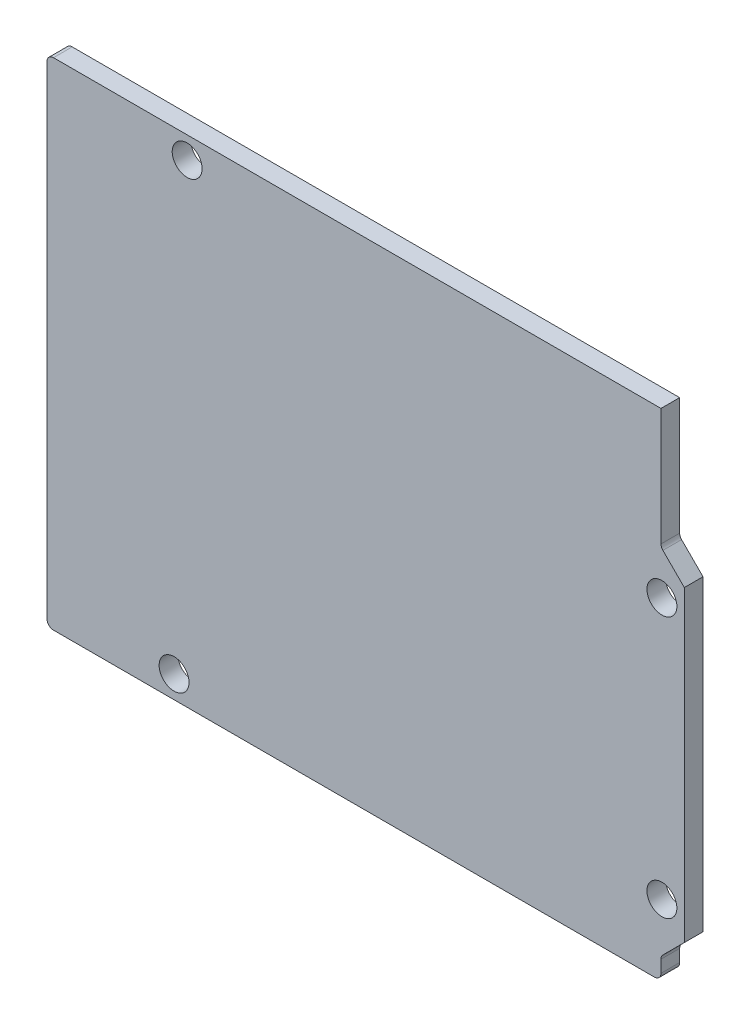
ISO-10303-21;
HEADER;
FILE_DESCRIPTION(('STEP AP214'),'2;1');
FILE_NAME('part.step','',(''),(''),'','','');
FILE_SCHEMA(('AUTOMOTIVE_DESIGN { 1 0 10303 214 1 1 1 1 }'));
ENDSEC;
DATA;
#1=APPLICATION_CONTEXT('core data for automotive mechanical design processes');
#2=APPLICATION_PROTOCOL_DEFINITION('international standard','automotive_design',2000,#1);
#3=PRODUCT_CONTEXT('',#1,'mechanical');
#4=PRODUCT('Part','Part','',(#3));
#5=PRODUCT_RELATED_PRODUCT_CATEGORY('part','',(#4));
#6=PRODUCT_DEFINITION_FORMATION('','',#4);
#7=PRODUCT_DEFINITION_CONTEXT('part definition',#1,'design');
#8=PRODUCT_DEFINITION('design','',#6,#7);
#9=PRODUCT_DEFINITION_SHAPE('','',#8);
#10=(LENGTH_UNIT() NAMED_UNIT(*) SI_UNIT(.MILLI.,.METRE.));
#11=(NAMED_UNIT(*) PLANE_ANGLE_UNIT() SI_UNIT($,.RADIAN.));
#12=(NAMED_UNIT(*) SI_UNIT($,.STERADIAN.) SOLID_ANGLE_UNIT());
#13=UNCERTAINTY_MEASURE_WITH_UNIT(LENGTH_MEASURE(1.E-05),#10,'distance_accuracy_value','');
#14=(GEOMETRIC_REPRESENTATION_CONTEXT(3) GLOBAL_UNCERTAINTY_ASSIGNED_CONTEXT((#13)) GLOBAL_UNIT_ASSIGNED_CONTEXT((#10,
#11,#12)) REPRESENTATION_CONTEXT('',''));
#15=CARTESIAN_POINT('',(0.,0.,0.));
#16=DIRECTION('',(0.,0.,1.));
#17=DIRECTION('',(1.,0.,0.));
#18=AXIS2_PLACEMENT_3D('',#15,#16,#17);
#19=CARTESIAN_POINT('',(-36.5080291852134,0.,4.5));
#20=DIRECTION('',(1.,0.,0.));
#21=DIRECTION('',(0.,0.,-1.));
#22=AXIS2_PLACEMENT_3D('',#19,#20,#21);
#23=PLANE('',#22);
#24=DIRECTION('',(0.,-1.,0.));
#25=VECTOR('',#24,1.);
#26=CARTESIAN_POINT('',(-36.5080291852134,0.,2.5));
#27=LINE('',#26,#25);
#28=CARTESIAN_POINT('',(-36.5080291852134,-42.375,2.5));
#29=VERTEX_POINT('',#28);
#30=CARTESIAN_POINT('',(-36.5080291852134,-94.025,2.5));
#31=VERTEX_POINT('',#30);
#32=EDGE_CURVE('E175',#29,#31,#27,.T.);
#33=ORIENTED_EDGE('',*,*,#32,.T.);
#34=DIRECTION('',(0.,0.,-1.));
#35=VECTOR('',#34,1.);
#36=CARTESIAN_POINT('',(-36.5080291852134,-94.025,4.5));
#37=LINE('',#36,#35);
#38=CARTESIAN_POINT('',(-36.5080291852134,-94.025,4.5));
#39=VERTEX_POINT('',#38);
#40=EDGE_CURVE('E11',#39,#31,#37,.T.);
#41=ORIENTED_EDGE('',*,*,#40,.F.);
#42=DIRECTION('',(0.,-1.,0.));
#43=VECTOR('',#42,1.);
#44=CARTESIAN_POINT('',(-36.5080291852134,0.,4.5));
#45=LINE('',#44,#43);
#46=CARTESIAN_POINT('',(-36.5080291852134,-42.375,4.5));
#47=VERTEX_POINT('',#46);
#48=EDGE_CURVE('E267',#47,#39,#45,.T.);
#49=ORIENTED_EDGE('',*,*,#48,.F.);
#50=DIRECTION('',(0.,0.,-1.));
#51=VECTOR('',#50,1.);
#52=CARTESIAN_POINT('',(-36.5080291852134,-42.375,4.5));
#53=LINE('',#52,#51);
#54=EDGE_CURVE('E159',#47,#29,#53,.T.);
#55=ORIENTED_EDGE('',*,*,#54,.T.);
#56=EDGE_LOOP('',(#33,#41,#49,#55));
#57=FACE_BOUND('',#56,.T.);
#58=ADVANCED_FACE('F37',(#57),#23,.F.);
#59=CARTESIAN_POINT('',(-35.8080291852134,-94.025,4.5));
#60=DIRECTION('',(0.,0.,-1.));
#61=DIRECTION('',(-1.,0.,0.));
#62=AXIS2_PLACEMENT_3D('',#59,#60,#61);
#63=CYLINDRICAL_SURFACE('',#62,0.700000000000003);
#64=CARTESIAN_POINT('',(-35.8080291852134,-94.025,2.5));
#65=DIRECTION('',(0.,0.,1.));
#66=DIRECTION('',(1.,0.,0.));
#67=AXIS2_PLACEMENT_3D('',#64,#65,#66);
#68=CIRCLE('',#67,0.700000000000003);
#69=CARTESIAN_POINT('',(-35.8080291852134,-94.725,2.5));
#70=VERTEX_POINT('',#69);
#71=EDGE_CURVE('E178',#31,#70,#68,.T.);
#72=ORIENTED_EDGE('',*,*,#71,.T.);
#73=DIRECTION('',(0.,0.,-1.));
#74=VECTOR('',#73,1.);
#75=CARTESIAN_POINT('',(-35.8080291852134,-94.725,4.5));
#76=LINE('',#75,#74);
#77=CARTESIAN_POINT('',(-35.8080291852134,-94.725,4.5));
#78=VERTEX_POINT('',#77);
#79=EDGE_CURVE('E46',#78,#70,#76,.T.);
#80=ORIENTED_EDGE('',*,*,#79,.F.);
#81=CARTESIAN_POINT('',(-35.8080291852134,-94.025,4.5));
#82=DIRECTION('',(0.,0.,1.));
#83=DIRECTION('',(1.,0.,0.));
#84=AXIS2_PLACEMENT_3D('',#81,#82,#83);
#85=CIRCLE('',#84,0.700000000000003);
#86=EDGE_CURVE('E112',#39,#78,#85,.T.);
#87=ORIENTED_EDGE('',*,*,#86,.F.);
#88=ORIENTED_EDGE('',*,*,#40,.T.);
#89=EDGE_LOOP('',(#72,#80,#87,#88));
#90=FACE_BOUND('',#89,.T.);
#91=ADVANCED_FACE('F282',(#90),#63,.T.);
#92=CARTESIAN_POINT('',(0.,-94.725,4.5));
#93=DIRECTION('',(0.,1.,0.));
#94=DIRECTION('',(0.,0.,1.));
#95=AXIS2_PLACEMENT_3D('',#92,#93,#94);
#96=PLANE('',#95);
#97=DIRECTION('',(1.,0.,0.));
#98=VECTOR('',#97,1.);
#99=CARTESIAN_POINT('',(0.,-94.725,2.5));
#100=LINE('',#99,#98);
#101=CARTESIAN_POINT('',(28.4919708147866,-94.725,2.5));
#102=VERTEX_POINT('',#101);
#103=EDGE_CURVE('E180',#70,#102,#100,.T.);
#104=ORIENTED_EDGE('',*,*,#103,.T.);
#105=DIRECTION('',(0.,0.,-1.));
#106=VECTOR('',#105,1.);
#107=CARTESIAN_POINT('',(28.4919708147866,-94.725,4.5));
#108=LINE('',#107,#106);
#109=CARTESIAN_POINT('',(28.4919708147866,-94.725,4.5));
#110=VERTEX_POINT('',#109);
#111=EDGE_CURVE('E222',#110,#102,#108,.T.);
#112=ORIENTED_EDGE('',*,*,#111,.F.);
#113=DIRECTION('',(1.,0.,0.));
#114=VECTOR('',#113,1.);
#115=CARTESIAN_POINT('',(0.,-94.725,4.5));
#116=LINE('',#115,#114);
#117=EDGE_CURVE('E230',#78,#110,#116,.T.);
#118=ORIENTED_EDGE('',*,*,#117,.F.);
#119=ORIENTED_EDGE('',*,*,#79,.T.);
#120=EDGE_LOOP('',(#104,#112,#118,#119));
#121=FACE_BOUND('',#120,.T.);
#122=ADVANCED_FACE('F228',(#121),#96,.F.);
#123=CARTESIAN_POINT('',(28.4919708147866,-94.025,4.5));
#124=DIRECTION('',(0.,0.,-1.));
#125=DIRECTION('',(-1.,0.,0.));
#126=AXIS2_PLACEMENT_3D('',#123,#124,#125);
#127=CYLINDRICAL_SURFACE('',#126,0.700000000000006);
#128=CARTESIAN_POINT('',(28.4919708147866,-94.025,2.5));
#129=DIRECTION('',(0.,0.,1.));
#130=DIRECTION('',(1.,0.,0.));
#131=AXIS2_PLACEMENT_3D('',#128,#129,#130);
#132=CIRCLE('',#131,0.700000000000006);
#133=CARTESIAN_POINT('',(29.1919708147866,-94.025,2.5));
#134=VERTEX_POINT('',#133);
#135=EDGE_CURVE('E182',#102,#134,#132,.T.);
#136=ORIENTED_EDGE('',*,*,#135,.T.);
#137=DIRECTION('',(0.,0.,-1.));
#138=VECTOR('',#137,1.);
#139=CARTESIAN_POINT('',(29.1919708147866,-94.025,4.5));
#140=LINE('',#139,#138);
#141=CARTESIAN_POINT('',(29.1919708147866,-94.025,4.5));
#142=VERTEX_POINT('',#141);
#143=EDGE_CURVE('E219',#142,#134,#140,.T.);
#144=ORIENTED_EDGE('',*,*,#143,.F.);
#145=CARTESIAN_POINT('',(28.4919708147866,-94.025,4.5));
#146=DIRECTION('',(0.,0.,1.));
#147=DIRECTION('',(1.,0.,0.));
#148=AXIS2_PLACEMENT_3D('',#145,#146,#147);
#149=CIRCLE('',#148,0.700000000000006);
#150=EDGE_CURVE('E248',#110,#142,#149,.T.);
#151=ORIENTED_EDGE('',*,*,#150,.F.);
#152=ORIENTED_EDGE('',*,*,#111,.T.);
#153=EDGE_LOOP('',(#136,#144,#151,#152));
#154=FACE_BOUND('',#153,.T.);
#155=ADVANCED_FACE('F238',(#154),#127,.T.);
#156=CARTESIAN_POINT('',(29.1919708147866,0.,4.5));
#157=DIRECTION('',(-1.,0.,0.));
#158=DIRECTION('',(0.,0.,1.));
#159=AXIS2_PLACEMENT_3D('',#156,#157,#158);
#160=PLANE('',#159);
#161=DIRECTION('',(0.,1.,0.));
#162=VECTOR('',#161,1.);
#163=CARTESIAN_POINT('',(29.1919708147866,0.,2.5));
#164=LINE('',#163,#162);
#165=CARTESIAN_POINT('',(29.1919708147866,-92.7149494936612,2.5));
#166=VERTEX_POINT('',#165);
#167=EDGE_CURVE('E184',#134,#166,#164,.T.);
#168=ORIENTED_EDGE('',*,*,#167,.T.);
#169=DIRECTION('',(0.,0.,-1.));
#170=VECTOR('',#169,1.);
#171=CARTESIAN_POINT('',(29.1919708147866,-92.7149494936612,4.5));
#172=LINE('',#171,#170);
#173=CARTESIAN_POINT('',(29.1919708147866,-92.7149494936612,4.5));
#174=VERTEX_POINT('',#173);
#175=EDGE_CURVE('E217',#174,#166,#172,.T.);
#176=ORIENTED_EDGE('',*,*,#175,.F.);
#177=DIRECTION('',(0.,1.,0.));
#178=VECTOR('',#177,1.);
#179=CARTESIAN_POINT('',(29.1919708147866,0.,4.5));
#180=LINE('',#179,#178);
#181=EDGE_CURVE('E244',#142,#174,#180,.T.);
#182=ORIENTED_EDGE('',*,*,#181,.F.);
#183=ORIENTED_EDGE('',*,*,#143,.T.);
#184=EDGE_LOOP('',(#168,#176,#182,#183));
#185=FACE_BOUND('',#184,.T.);
#186=ADVANCED_FACE('F242',(#185),#160,.F.);
#187=CARTESIAN_POINT('',(29.8919708147866,-92.7149494936612,4.5));
#188=DIRECTION('',(0.,0.,-1.));
#189=DIRECTION('',(-1.,0.,0.));
#190=AXIS2_PLACEMENT_3D('',#187,#188,#189);
#191=CYLINDRICAL_SURFACE('',#190,0.700000000000002);
#192=CARTESIAN_POINT('',(29.8919708147866,-92.7149494936612,2.5));
#193=DIRECTION('',(0.,0.,1.));
#194=DIRECTION('',(1.,0.,0.));
#195=AXIS2_PLACEMENT_3D('',#192,#193,#194);
#196=CIRCLE('',#195,0.700000000000002);
#197=CARTESIAN_POINT('',(29.396996067956,-92.2199747468306,2.5));
#198=VERTEX_POINT('',#197);
#199=EDGE_CURVE('E187',#198,#166,#196,.T.);
#200=ORIENTED_EDGE('',*,*,#199,.F.);
#201=DIRECTION('',(0.,0.,-1.));
#202=VECTOR('',#201,1.);
#203=CARTESIAN_POINT('',(29.396996067956,-92.2199747468306,4.5));
#204=LINE('',#203,#202);
#205=CARTESIAN_POINT('',(29.396996067956,-92.2199747468306,4.5));
#206=VERTEX_POINT('',#205);
#207=EDGE_CURVE('E215',#206,#198,#204,.T.);
#208=ORIENTED_EDGE('',*,*,#207,.F.);
#209=CARTESIAN_POINT('',(29.8919708147866,-92.7149494936612,4.5));
#210=DIRECTION('',(0.,0.,1.));
#211=DIRECTION('',(1.,0.,0.));
#212=AXIS2_PLACEMENT_3D('',#209,#210,#211);
#213=CIRCLE('',#212,0.700000000000002);
#214=EDGE_CURVE('E247',#206,#174,#213,.T.);
#215=ORIENTED_EDGE('',*,*,#214,.T.);
#216=ORIENTED_EDGE('',*,*,#175,.T.);
#217=EDGE_LOOP('',(#200,#208,#215,#216));
#218=FACE_BOUND('',#217,.T.);
#219=ADVANCED_FACE('F403',(#218),#191,.F.);
#220=CARTESIAN_POINT('',(60.8084854073933,-60.8084854073932,4.5));
#221=DIRECTION('',(-0.707106781186549,0.707106781186546,0.));
#222=DIRECTION('',(-0.707106781186546,-0.707106781186549,0.));
#223=AXIS2_PLACEMENT_3D('',#220,#221,#222);
#224=PLANE('',#223);
#225=DIRECTION('',(0.707106781186546,0.707106781186549,0.));
#226=VECTOR('',#225,1.);
#227=CARTESIAN_POINT('',(60.8084854073933,-60.8084854073932,2.5));
#228=LINE('',#227,#226);
#229=CARTESIAN_POINT('',(31.6919708147866,-89.925,2.5));
#230=VERTEX_POINT('',#229);
#231=EDGE_CURVE('E190',#198,#230,#228,.T.);
#232=ORIENTED_EDGE('',*,*,#231,.T.);
#233=DIRECTION('',(0.,0.,-1.));
#234=VECTOR('',#233,1.);
#235=CARTESIAN_POINT('',(31.6919708147866,-89.925,4.5));
#236=LINE('',#235,#234);
#237=CARTESIAN_POINT('',(31.6919708147866,-89.925,4.5));
#238=VERTEX_POINT('',#237);
#239=EDGE_CURVE('E212',#238,#230,#236,.T.);
#240=ORIENTED_EDGE('',*,*,#239,.F.);
#241=DIRECTION('',(0.707106781186546,0.707106781186549,0.));
#242=VECTOR('',#241,1.);
#243=CARTESIAN_POINT('',(60.8084854073933,-60.8084854073932,4.5));
#244=LINE('',#243,#242);
#245=EDGE_CURVE('E250',#206,#238,#244,.T.);
#246=ORIENTED_EDGE('',*,*,#245,.F.);
#247=ORIENTED_EDGE('',*,*,#207,.T.);
#248=EDGE_LOOP('',(#232,#240,#246,#247));
#249=FACE_BOUND('',#248,.T.);
#250=ADVANCED_FACE('F393',(#249),#224,.F.);
#251=CARTESIAN_POINT('',(31.6919708147866,0.,4.5));
#252=DIRECTION('',(-1.,0.,0.));
#253=DIRECTION('',(0.,-1.,0.));
#254=AXIS2_PLACEMENT_3D('',#251,#252,#253);
#255=PLANE('',#254);
#256=DIRECTION('',(0.,1.,0.));
#257=VECTOR('',#256,1.);
#258=CARTESIAN_POINT('',(31.6919708147866,0.,2.5));
#259=LINE('',#258,#257);
#260=CARTESIAN_POINT('',(31.6919708147866,-57.025,2.5));
#261=VERTEX_POINT('',#260);
#262=EDGE_CURVE('E192',#230,#261,#259,.T.);
#263=ORIENTED_EDGE('',*,*,#262,.T.);
#264=DIRECTION('',(0.,0.,-1.));
#265=VECTOR('',#264,1.);
#266=CARTESIAN_POINT('',(31.6919708147866,-57.025,4.5));
#267=LINE('',#266,#265);
#268=CARTESIAN_POINT('',(31.6919708147866,-57.025,4.5));
#269=VERTEX_POINT('',#268);
#270=EDGE_CURVE('E209',#269,#261,#267,.T.);
#271=ORIENTED_EDGE('',*,*,#270,.F.);
#272=DIRECTION('',(0.,1.,0.));
#273=VECTOR('',#272,1.);
#274=CARTESIAN_POINT('',(31.6919708147866,0.,4.5));
#275=LINE('',#274,#273);
#276=EDGE_CURVE('E256',#238,#269,#275,.T.);
#277=ORIENTED_EDGE('',*,*,#276,.F.);
#278=ORIENTED_EDGE('',*,*,#239,.T.);
#279=EDGE_LOOP('',(#263,#271,#277,#278));
#280=FACE_BOUND('',#279,.T.);
#281=ADVANCED_FACE('F383',(#280),#255,.F.);
#282=CARTESIAN_POINT('',(-12.6665145926068,-12.6665145926068,4.5));
#283=DIRECTION('',(-0.707106781186546,-0.707106781186549,0.));
#284=DIRECTION('',(0.707106781186549,-0.707106781186546,0.));
#285=AXIS2_PLACEMENT_3D('',#282,#283,#284);
#286=PLANE('',#285);
#287=DIRECTION('',(-0.707106781186549,0.707106781186546,0.));
#288=VECTOR('',#287,1.);
#289=CARTESIAN_POINT('',(-12.6665145926068,-12.6665145926068,2.5));
#290=LINE('',#289,#288);
#291=CARTESIAN_POINT('',(29.396996067956,-54.7300252531695,2.5));
#292=VERTEX_POINT('',#291);
#293=EDGE_CURVE('E194',#261,#292,#290,.T.);
#294=ORIENTED_EDGE('',*,*,#293,.T.);
#295=DIRECTION('',(0.,0.,-1.));
#296=VECTOR('',#295,1.);
#297=CARTESIAN_POINT('',(29.396996067956,-54.7300252531695,4.5));
#298=LINE('',#297,#296);
#299=CARTESIAN_POINT('',(29.396996067956,-54.7300252531695,4.5));
#300=VERTEX_POINT('',#299);
#301=EDGE_CURVE('E207',#300,#292,#298,.T.);
#302=ORIENTED_EDGE('',*,*,#301,.F.);
#303=DIRECTION('',(-0.707106781186549,0.707106781186546,0.));
#304=VECTOR('',#303,1.);
#305=CARTESIAN_POINT('',(-12.6665145926068,-12.6665145926068,4.5));
#306=LINE('',#305,#304);
#307=EDGE_CURVE('E258',#269,#300,#306,.T.);
#308=ORIENTED_EDGE('',*,*,#307,.F.);
#309=ORIENTED_EDGE('',*,*,#270,.T.);
#310=EDGE_LOOP('',(#294,#302,#308,#309));
#311=FACE_BOUND('',#310,.T.);
#312=ADVANCED_FACE('F374',(#311),#286,.F.);
#313=CARTESIAN_POINT('',(29.8919708147866,-54.2350505063389,4.5));
#314=DIRECTION('',(0.,0.,-1.));
#315=DIRECTION('',(-1.,0.,0.));
#316=AXIS2_PLACEMENT_3D('',#313,#314,#315);
#317=CYLINDRICAL_SURFACE('',#316,0.700000000000001);
#318=CARTESIAN_POINT('',(29.8919708147866,-54.2350505063389,2.5));
#319=DIRECTION('',(0.,0.,1.));
#320=DIRECTION('',(1.,0.,0.));
#321=AXIS2_PLACEMENT_3D('',#318,#319,#320);
#322=CIRCLE('',#321,0.700000000000001);
#323=CARTESIAN_POINT('',(29.1919708147866,-54.2350505063389,2.5));
#324=VERTEX_POINT('',#323);
#325=EDGE_CURVE('E197',#324,#292,#322,.T.);
#326=ORIENTED_EDGE('',*,*,#325,.F.);
#327=DIRECTION('',(0.,0.,-1.));
#328=VECTOR('',#327,1.);
#329=CARTESIAN_POINT('',(29.1919708147866,-54.2350505063389,4.5));
#330=LINE('',#329,#328);
#331=CARTESIAN_POINT('',(29.1919708147866,-54.2350505063389,4.5));
#332=VERTEX_POINT('',#331);
#333=EDGE_CURVE('E154',#332,#324,#330,.T.);
#334=ORIENTED_EDGE('',*,*,#333,.F.);
#335=CARTESIAN_POINT('',(29.8919708147866,-54.2350505063389,4.5));
#336=DIRECTION('',(0.,0.,1.));
#337=DIRECTION('',(1.,0.,0.));
#338=AXIS2_PLACEMENT_3D('',#335,#336,#337);
#339=CIRCLE('',#338,0.700000000000001);
#340=EDGE_CURVE('E147',#332,#300,#339,.T.);
#341=ORIENTED_EDGE('',*,*,#340,.T.);
#342=ORIENTED_EDGE('',*,*,#301,.T.);
#343=EDGE_LOOP('',(#326,#334,#341,#342));
#344=FACE_BOUND('',#343,.T.);
#345=ADVANCED_FACE('F261',(#344),#317,.F.);
#346=CARTESIAN_POINT('',(29.1919708147866,0.,4.5));
#347=DIRECTION('',(-1.,0.,0.));
#348=DIRECTION('',(0.,-1.,0.));
#349=AXIS2_PLACEMENT_3D('',#346,#347,#348);
#350=PLANE('',#349);
#351=DIRECTION('',(0.,1.,0.));
#352=VECTOR('',#351,1.);
#353=CARTESIAN_POINT('',(29.1919708147866,0.,2.5));
#354=LINE('',#353,#352);
#355=CARTESIAN_POINT('',(29.1919708147866,-41.675,2.5));
#356=VERTEX_POINT('',#355);
#357=EDGE_CURVE('E153',#324,#356,#354,.T.);
#358=ORIENTED_EDGE('',*,*,#357,.T.);
#359=DIRECTION('',(0.,0.,-1.));
#360=VECTOR('',#359,1.);
#361=CARTESIAN_POINT('',(29.1919708147866,-41.675,4.5));
#362=LINE('',#361,#360);
#363=CARTESIAN_POINT('',(29.1919708147866,-41.675,4.5));
#364=VERTEX_POINT('',#363);
#365=EDGE_CURVE('E150',#364,#356,#362,.T.);
#366=ORIENTED_EDGE('',*,*,#365,.F.);
#367=DIRECTION('',(0.,1.,0.));
#368=VECTOR('',#367,1.);
#369=CARTESIAN_POINT('',(29.1919708147866,0.,4.5));
#370=LINE('',#369,#368);
#371=EDGE_CURVE('E141',#332,#364,#370,.T.);
#372=ORIENTED_EDGE('',*,*,#371,.F.);
#373=ORIENTED_EDGE('',*,*,#333,.T.);
#374=EDGE_LOOP('',(#358,#366,#372,#373));
#375=FACE_BOUND('',#374,.T.);
#376=ADVANCED_FACE('F151',(#375),#350,.F.);
#377=CARTESIAN_POINT('',(0.,-41.675,4.5));
#378=DIRECTION('',(0.,-1.,0.));
#379=DIRECTION('',(0.,0.,-1.));
#380=AXIS2_PLACEMENT_3D('',#377,#378,#379);
#381=PLANE('',#380);
#382=DIRECTION('',(-1.,0.,0.));
#383=VECTOR('',#382,1.);
#384=CARTESIAN_POINT('',(0.,-41.675,2.5));
#385=LINE('',#384,#383);
#386=CARTESIAN_POINT('',(-35.8080291852134,-41.675,2.5));
#387=VERTEX_POINT('',#386);
#388=EDGE_CURVE('E98',#356,#387,#385,.T.);
#389=ORIENTED_EDGE('',*,*,#388,.T.);
#390=DIRECTION('',(0.,0.,-1.));
#391=VECTOR('',#390,1.);
#392=CARTESIAN_POINT('',(-35.8080291852134,-41.675,4.5));
#393=LINE('',#392,#391);
#394=CARTESIAN_POINT('',(-35.8080291852134,-41.675,4.5));
#395=VERTEX_POINT('',#394);
#396=EDGE_CURVE('E155',#395,#387,#393,.T.);
#397=ORIENTED_EDGE('',*,*,#396,.F.);
#398=DIRECTION('',(-1.,0.,0.));
#399=VECTOR('',#398,1.);
#400=CARTESIAN_POINT('',(0.,-41.675,4.5));
#401=LINE('',#400,#399);
#402=EDGE_CURVE('E145',#364,#395,#401,.T.);
#403=ORIENTED_EDGE('',*,*,#402,.F.);
#404=ORIENTED_EDGE('',*,*,#365,.T.);
#405=EDGE_LOOP('',(#389,#397,#403,#404));
#406=FACE_BOUND('',#405,.T.);
#407=ADVANCED_FACE('F157',(#406),#381,.F.);
#408=CARTESIAN_POINT('',(29.2919708147866,-87.125,4.5));
#409=DIRECTION('',(0.,0.,-1.));
#410=DIRECTION('',(-1.,0.,0.));
#411=AXIS2_PLACEMENT_3D('',#408,#409,#410);
#412=CYLINDRICAL_SURFACE('',#411,1.60000000000001);
#413=CARTESIAN_POINT('',(29.2919708147866,-87.125,4.5));
#414=DIRECTION('',(0.,0.,1.));
#415=DIRECTION('',(1.,0.,0.));
#416=AXIS2_PLACEMENT_3D('',#413,#414,#415);
#417=CIRCLE('',#416,1.60000000000001);
#418=CARTESIAN_POINT('',(30.8919708147866,-87.125,4.5));
#419=VERTEX_POINT('',#418);
#420=EDGE_CURVE('E466',#419,#419,#417,.T.);
#421=ORIENTED_EDGE('',*,*,#420,.T.);
#422=EDGE_LOOP('',(#421));
#423=FACE_BOUND('',#422,.T.);
#424=CARTESIAN_POINT('',(29.2919708147866,-87.125,2.5));
#425=DIRECTION('',(0.,0.,1.));
#426=DIRECTION('',(1.,0.,0.));
#427=AXIS2_PLACEMENT_3D('',#424,#425,#426);
#428=CIRCLE('',#427,1.60000000000001);
#429=CARTESIAN_POINT('',(30.8919708147866,-87.125,2.5));
#430=VERTEX_POINT('',#429);
#431=EDGE_CURVE('E172',#430,#430,#428,.T.);
#432=ORIENTED_EDGE('',*,*,#431,.F.);
#433=EDGE_LOOP('',(#432));
#434=FACE_BOUND('',#433,.T.);
#435=ADVANCED_FACE('F290',(#423,#434),#412,.F.);
#436=CARTESIAN_POINT('',(29.2919708147866,-59.175,4.5));
#437=DIRECTION('',(0.,0.,-1.));
#438=DIRECTION('',(-1.,0.,0.));
#439=AXIS2_PLACEMENT_3D('',#436,#437,#438);
#440=CYLINDRICAL_SURFACE('',#439,1.60000000000001);
#441=CARTESIAN_POINT('',(29.2919708147866,-59.175,4.5));
#442=DIRECTION('',(0.,0.,1.));
#443=DIRECTION('',(1.,0.,0.));
#444=AXIS2_PLACEMENT_3D('',#441,#442,#443);
#445=CIRCLE('',#444,1.60000000000001);
#446=CARTESIAN_POINT('',(30.8919708147866,-59.175,4.5));
#447=VERTEX_POINT('',#446);
#448=EDGE_CURVE('E463',#447,#447,#445,.T.);
#449=ORIENTED_EDGE('',*,*,#448,.T.);
#450=EDGE_LOOP('',(#449));
#451=FACE_BOUND('',#450,.T.);
#452=CARTESIAN_POINT('',(29.2919708147866,-59.175,2.5));
#453=DIRECTION('',(0.,0.,1.));
#454=DIRECTION('',(1.,0.,0.));
#455=AXIS2_PLACEMENT_3D('',#452,#453,#454);
#456=CIRCLE('',#455,1.60000000000001);
#457=CARTESIAN_POINT('',(30.8919708147866,-59.175,2.5));
#458=VERTEX_POINT('',#457);
#459=EDGE_CURVE('E169',#458,#458,#456,.T.);
#460=ORIENTED_EDGE('',*,*,#459,.F.);
#461=EDGE_LOOP('',(#460));
#462=FACE_BOUND('',#461,.T.);
#463=ADVANCED_FACE('F293',(#451,#462),#440,.F.);
#464=CARTESIAN_POINT('',(-22.9080291852134,-92.325,4.5));
#465=DIRECTION('',(0.,0.,-1.));
#466=DIRECTION('',(-1.,0.,0.));
#467=AXIS2_PLACEMENT_3D('',#464,#465,#466);
#468=CYLINDRICAL_SURFACE('',#467,1.60000000000001);
#469=CARTESIAN_POINT('',(-22.9080291852134,-92.325,4.5));
#470=DIRECTION('',(0.,0.,1.));
#471=DIRECTION('',(1.,0.,0.));
#472=AXIS2_PLACEMENT_3D('',#469,#470,#471);
#473=CIRCLE('',#472,1.60000000000001);
#474=CARTESIAN_POINT('',(-21.3080291852134,-92.325,4.5));
#475=VERTEX_POINT('',#474);
#476=EDGE_CURVE('E304',#475,#475,#473,.T.);
#477=ORIENTED_EDGE('',*,*,#476,.T.);
#478=EDGE_LOOP('',(#477));
#479=FACE_BOUND('',#478,.T.);
#480=CARTESIAN_POINT('',(-22.9080291852134,-92.325,2.5));
#481=DIRECTION('',(0.,0.,1.));
#482=DIRECTION('',(1.,0.,0.));
#483=AXIS2_PLACEMENT_3D('',#480,#481,#482);
#484=CIRCLE('',#483,1.60000000000001);
#485=CARTESIAN_POINT('',(-21.3080291852134,-92.325,2.5));
#486=VERTEX_POINT('',#485);
#487=EDGE_CURVE('E166',#486,#486,#484,.T.);
#488=ORIENTED_EDGE('',*,*,#487,.F.);
#489=EDGE_LOOP('',(#488));
#490=FACE_BOUND('',#489,.T.);
#491=ADVANCED_FACE('F277',(#479,#490),#468,.F.);
#492=CARTESIAN_POINT('',(-21.5080291852134,-44.025,4.5));
#493=DIRECTION('',(0.,0.,-1.));
#494=DIRECTION('',(-1.,0.,0.));
#495=AXIS2_PLACEMENT_3D('',#492,#493,#494);
#496=CYLINDRICAL_SURFACE('',#495,1.6);
#497=CARTESIAN_POINT('',(-21.5080291852134,-44.025,4.5));
#498=DIRECTION('',(0.,0.,1.));
#499=DIRECTION('',(1.,0.,0.));
#500=AXIS2_PLACEMENT_3D('',#497,#498,#499);
#501=CIRCLE('',#500,1.6);
#502=CARTESIAN_POINT('',(-19.9080291852134,-44.025,4.5));
#503=VERTEX_POINT('',#502);
#504=EDGE_CURVE('E203',#503,#503,#501,.T.);
#505=ORIENTED_EDGE('',*,*,#504,.T.);
#506=EDGE_LOOP('',(#505));
#507=FACE_BOUND('',#506,.T.);
#508=CARTESIAN_POINT('',(-21.5080291852134,-44.025,2.5));
#509=DIRECTION('',(0.,0.,1.));
#510=DIRECTION('',(1.,0.,0.));
#511=AXIS2_PLACEMENT_3D('',#508,#509,#510);
#512=CIRCLE('',#511,1.6);
#513=CARTESIAN_POINT('',(-19.9080291852134,-44.025,2.5));
#514=VERTEX_POINT('',#513);
#515=EDGE_CURVE('E163',#514,#514,#512,.T.);
#516=ORIENTED_EDGE('',*,*,#515,.F.);
#517=EDGE_LOOP('',(#516));
#518=FACE_BOUND('',#517,.T.);
#519=ADVANCED_FACE('F39',(#507,#518),#496,.F.);
#520=CARTESIAN_POINT('',(-35.8080291852134,-42.375,4.5));
#521=DIRECTION('',(0.,0.,-1.));
#522=DIRECTION('',(-1.,0.,0.));
#523=AXIS2_PLACEMENT_3D('',#520,#521,#522);
#524=CYLINDRICAL_SURFACE('',#523,0.699999999999999);
#525=CARTESIAN_POINT('',(-35.8080291852134,-42.375,2.5));
#526=DIRECTION('',(0.,0.,1.));
#527=DIRECTION('',(1.,0.,0.));
#528=AXIS2_PLACEMENT_3D('',#525,#526,#527);
#529=CIRCLE('',#528,0.699999999999999);
#530=EDGE_CURVE('E104',#387,#29,#529,.T.);
#531=ORIENTED_EDGE('',*,*,#530,.T.);
#532=ORIENTED_EDGE('',*,*,#54,.F.);
#533=CARTESIAN_POINT('',(-35.8080291852134,-42.375,4.5));
#534=DIRECTION('',(0.,0.,1.));
#535=DIRECTION('',(1.,0.,0.));
#536=AXIS2_PLACEMENT_3D('',#533,#534,#535);
#537=CIRCLE('',#536,0.699999999999999);
#538=EDGE_CURVE('E54',#395,#47,#537,.T.);
#539=ORIENTED_EDGE('',*,*,#538,.F.);
#540=ORIENTED_EDGE('',*,*,#396,.T.);
#541=EDGE_LOOP('',(#531,#532,#539,#540));
#542=FACE_BOUND('',#541,.T.);
#543=ADVANCED_FACE('F268',(#542),#524,.T.);
#544=CARTESIAN_POINT('',(0.,0.,4.5));
#545=DIRECTION('',(0.,0.,1.));
#546=DIRECTION('',(1.,0.,0.));
#547=AXIS2_PLACEMENT_3D('',#544,#545,#546);
#548=PLANE('',#547);
#549=ORIENTED_EDGE('',*,*,#504,.F.);
#550=EDGE_LOOP('',(#549));
#551=FACE_BOUND('',#550,.T.);
#552=ORIENTED_EDGE('',*,*,#476,.F.);
#553=EDGE_LOOP('',(#552));
#554=FACE_BOUND('',#553,.T.);
#555=ORIENTED_EDGE('',*,*,#448,.F.);
#556=EDGE_LOOP('',(#555));
#557=FACE_BOUND('',#556,.T.);
#558=ORIENTED_EDGE('',*,*,#420,.F.);
#559=EDGE_LOOP('',(#558));
#560=FACE_BOUND('',#559,.T.);
#561=ORIENTED_EDGE('',*,*,#48,.T.);
#562=ORIENTED_EDGE('',*,*,#86,.T.);
#563=ORIENTED_EDGE('',*,*,#117,.T.);
#564=ORIENTED_EDGE('',*,*,#150,.T.);
#565=ORIENTED_EDGE('',*,*,#181,.T.);
#566=ORIENTED_EDGE('',*,*,#214,.F.);
#567=ORIENTED_EDGE('',*,*,#245,.T.);
#568=ORIENTED_EDGE('',*,*,#276,.T.);
#569=ORIENTED_EDGE('',*,*,#307,.T.);
#570=ORIENTED_EDGE('',*,*,#340,.F.);
#571=ORIENTED_EDGE('',*,*,#371,.T.);
#572=ORIENTED_EDGE('',*,*,#402,.T.);
#573=ORIENTED_EDGE('',*,*,#538,.T.);
#574=EDGE_LOOP('',(#561,#562,#563,#564,#565,#566,#567,#568,#569,#570,#571,#572,#573));
#575=FACE_BOUND('',#574,.T.);
#576=ADVANCED_FACE('F143',(#551,#554,#557,#560,#575),#548,.T.);
#577=CARTESIAN_POINT('',(0.,0.,2.5));
#578=DIRECTION('',(0.,0.,1.));
#579=DIRECTION('',(1.,0.,0.));
#580=AXIS2_PLACEMENT_3D('',#577,#578,#579);
#581=PLANE('',#580);
#582=ORIENTED_EDGE('',*,*,#515,.T.);
#583=EDGE_LOOP('',(#582));
#584=FACE_BOUND('',#583,.T.);
#585=ORIENTED_EDGE('',*,*,#487,.T.);
#586=EDGE_LOOP('',(#585));
#587=FACE_BOUND('',#586,.T.);
#588=ORIENTED_EDGE('',*,*,#459,.T.);
#589=EDGE_LOOP('',(#588));
#590=FACE_BOUND('',#589,.T.);
#591=ORIENTED_EDGE('',*,*,#431,.T.);
#592=EDGE_LOOP('',(#591));
#593=FACE_BOUND('',#592,.T.);
#594=ORIENTED_EDGE('',*,*,#32,.F.);
#595=ORIENTED_EDGE('',*,*,#530,.F.);
#596=ORIENTED_EDGE('',*,*,#388,.F.);
#597=ORIENTED_EDGE('',*,*,#357,.F.);
#598=ORIENTED_EDGE('',*,*,#325,.T.);
#599=ORIENTED_EDGE('',*,*,#293,.F.);
#600=ORIENTED_EDGE('',*,*,#262,.F.);
#601=ORIENTED_EDGE('',*,*,#231,.F.);
#602=ORIENTED_EDGE('',*,*,#199,.T.);
#603=ORIENTED_EDGE('',*,*,#167,.F.);
#604=ORIENTED_EDGE('',*,*,#135,.F.);
#605=ORIENTED_EDGE('',*,*,#103,.F.);
#606=ORIENTED_EDGE('',*,*,#71,.F.);
#607=EDGE_LOOP('',(#594,#595,#596,#597,#598,#599,#600,#601,#602,#603,#604,#605,#606));
#608=FACE_BOUND('',#607,.T.);
#609=ADVANCED_FACE('F234',(#584,#587,#590,#593,#608),#581,.F.);
#610=CLOSED_SHELL('',(#58,#91,#122,#155,#186,#219,#250,#281,#312,#345,#376,#407,#435,#463,#491,
#519,#543,#576,#609));
#611=MANIFOLD_SOLID_BREP('B2',#610);
#612=ADVANCED_BREP_SHAPE_REPRESENTATION('',(#18,#611),#14);
#613=SHAPE_DEFINITION_REPRESENTATION(#9,#612);
ENDSEC;
END-ISO-10303-21;
